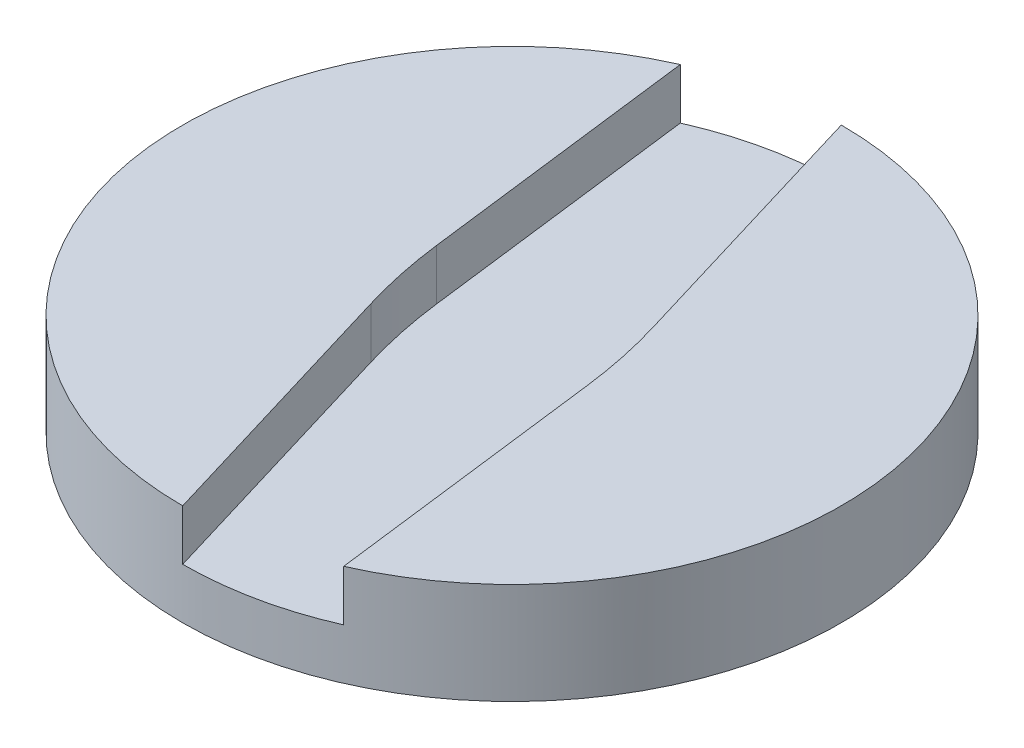
ISO-10303-21;
HEADER;
FILE_DESCRIPTION(('STEP AP214'),'2;1');
FILE_NAME('part.step','',(''),(''),'','','');
FILE_SCHEMA(('AUTOMOTIVE_DESIGN { 1 0 10303 214 1 1 1 1 }'));
ENDSEC;
DATA;
#1=APPLICATION_CONTEXT('core data for automotive mechanical design processes');
#2=APPLICATION_PROTOCOL_DEFINITION('international standard','automotive_design',2000,#1);
#3=PRODUCT_CONTEXT('',#1,'mechanical');
#4=PRODUCT('Part','Part','',(#3));
#5=PRODUCT_RELATED_PRODUCT_CATEGORY('part','',(#4));
#6=PRODUCT_DEFINITION_FORMATION('','',#4);
#7=PRODUCT_DEFINITION_CONTEXT('part definition',#1,'design');
#8=PRODUCT_DEFINITION('design','',#6,#7);
#9=PRODUCT_DEFINITION_SHAPE('','',#8);
#10=(LENGTH_UNIT() NAMED_UNIT(*) SI_UNIT(.MILLI.,.METRE.));
#11=(NAMED_UNIT(*) PLANE_ANGLE_UNIT() SI_UNIT($,.RADIAN.));
#12=(NAMED_UNIT(*) SI_UNIT($,.STERADIAN.) SOLID_ANGLE_UNIT());
#13=UNCERTAINTY_MEASURE_WITH_UNIT(LENGTH_MEASURE(1.E-05),#10,'distance_accuracy_value','');
#14=(GEOMETRIC_REPRESENTATION_CONTEXT(3) GLOBAL_UNCERTAINTY_ASSIGNED_CONTEXT((#13)) GLOBAL_UNIT_ASSIGNED_CONTEXT((#10,
#11,#12)) REPRESENTATION_CONTEXT('',''));
#15=CARTESIAN_POINT('',(0.,0.,0.));
#16=DIRECTION('',(0.,0.,1.));
#17=DIRECTION('',(1.,0.,0.));
#18=AXIS2_PLACEMENT_3D('',#15,#16,#17);
#19=CARTESIAN_POINT('',(0.,4.,0.));
#20=DIRECTION('',(0.,1.,0.));
#21=DIRECTION('',(0.,0.,1.));
#22=AXIS2_PLACEMENT_3D('',#19,#20,#21);
#23=PLANE('',#22);
#24=DIRECTION('',(-0.288132281827964,0.,-0.957590616165703));
#25=VECTOR('',#24,1.);
#26=CARTESIAN_POINT('',(3.18401077240658,4.,-2.38715001854733));
#27=LINE('',#26,#25);
#28=CARTESIAN_POINT('',(3.18401077240658,4.,-2.38715001854733));
#29=VERTEX_POINT('',#28);
#30=CARTESIAN_POINT('',(-0.00932114859532882,4.,-13.));
#31=VERTEX_POINT('',#30);
#32=EDGE_CURVE('E134',#29,#31,#27,.T.);
#33=ORIENTED_EDGE('',*,*,#32,.F.);
#34=CARTESIAN_POINT('',(-15.9678015509075,4.,3.37549561801202));
#35=DIRECTION('',(0.,1.,0.));
#36=DIRECTION('',(0.,0.,1.));
#37=AXIS2_PLACEMENT_3D('',#34,#35,#36);
#38=CIRCLE('',#37,20.);
#39=CARTESIAN_POINT('',(3.87769932245438,4.,0.8943476809888));
#40=VERTEX_POINT('',#39);
#41=EDGE_CURVE('E150',#40,#29,#38,.T.);
#42=ORIENTED_EDGE('',*,*,#41,.F.);
#43=DIRECTION('',(-0.124057396851164,0.,-0.992275043668092));
#44=VECTOR('',#43,1.);
#45=CARTESIAN_POINT('',(3.70792725026108,4.,-0.463576913796444));
#46=LINE('',#45,#44);
#47=CARTESIAN_POINT('',(5.25261058951684,4.,11.8915971170779));
#48=VERTEX_POINT('',#47);
#49=EDGE_CURVE('E190',#48,#40,#46,.T.);
#50=ORIENTED_EDGE('',*,*,#49,.F.);
#51=CARTESIAN_POINT('',(0.,4.,0.));
#52=DIRECTION('',(0.,1.,0.));
#53=DIRECTION('',(0.,0.,1.));
#54=AXIS2_PLACEMENT_3D('',#51,#52,#53);
#55=CIRCLE('',#54,13.);
#56=EDGE_CURVE('E184',#48,#31,#55,.T.);
#57=ORIENTED_EDGE('',*,*,#56,.T.);
#58=EDGE_LOOP('',(#33,#42,#50,#57));
#59=FACE_BOUND('',#58,.T.);
#60=ADVANCED_FACE('F45',(#59),#23,.T.);
#61=CARTESIAN_POINT('',(0.,4.,0.));
#62=DIRECTION('',(0.,-1.,0.));
#63=DIRECTION('',(0.,0.,-1.));
#64=AXIS2_PLACEMENT_3D('',#61,#62,#63);
#65=CYLINDRICAL_SURFACE('',#64,13.);
#66=ORIENTED_EDGE('',*,*,#56,.F.);
#67=DIRECTION('',(0.,-1.,0.));
#68=VECTOR('',#67,1.);
#69=CARTESIAN_POINT('',(5.25261058951683,4.,11.8915971170779));
#70=LINE('',#69,#68);
#71=CARTESIAN_POINT('',(5.25261058951683,2.,11.8915971170779));
#72=VERTEX_POINT('',#71);
#73=EDGE_CURVE('E167',#48,#72,#70,.T.);
#74=ORIENTED_EDGE('',*,*,#73,.T.);
#75=CARTESIAN_POINT('',(0.,2.,0.));
#76=DIRECTION('',(0.,1.,0.));
#77=DIRECTION('',(0.,0.,1.));
#78=AXIS2_PLACEMENT_3D('',#75,#76,#77);
#79=CIRCLE('',#78,13.);
#80=CARTESIAN_POINT('',(0.00932014332247211,2.,12.9999966590353));
#81=VERTEX_POINT('',#80);
#82=EDGE_CURVE('E11',#81,#72,#79,.T.);
#83=ORIENTED_EDGE('',*,*,#82,.F.);
#84=DIRECTION('',(0.,-1.,0.));
#85=VECTOR('',#84,1.);
#86=CARTESIAN_POINT('',(0.00932014332247211,4.,12.9999966590353));
#87=LINE('',#86,#85);
#88=CARTESIAN_POINT('',(0.0093211485952603,4.,13.));
#89=VERTEX_POINT('',#88);
#90=EDGE_CURVE('E125',#81,#89,#87,.F.);
#91=ORIENTED_EDGE('',*,*,#90,.T.);
#92=CARTESIAN_POINT('',(-5.25261058951682,4.,-11.8915971170779));
#93=VERTEX_POINT('',#92);
#94=EDGE_CURVE('E180',#93,#89,#55,.T.);
#95=ORIENTED_EDGE('',*,*,#94,.F.);
#96=DIRECTION('',(0.,-1.,0.));
#97=VECTOR('',#96,1.);
#98=CARTESIAN_POINT('',(-5.25261058951682,4.,-11.8915971170779));
#99=LINE('',#98,#97);
#100=CARTESIAN_POINT('',(-5.25261058951682,2.,-11.8915971170779));
#101=VERTEX_POINT('',#100);
#102=EDGE_CURVE('E175',#93,#101,#99,.T.);
#103=ORIENTED_EDGE('',*,*,#102,.T.);
#104=CARTESIAN_POINT('',(-0.00932014332254106,2.,-12.9999966590353));
#105=VERTEX_POINT('',#104);
#106=EDGE_CURVE('E49',#105,#101,#79,.T.);
#107=ORIENTED_EDGE('',*,*,#106,.F.);
#108=DIRECTION('',(0.,-1.,0.));
#109=VECTOR('',#108,1.);
#110=CARTESIAN_POINT('',(-0.00932014332253976,4.,-12.9999966590353));
#111=LINE('',#110,#109);
#112=EDGE_CURVE('E171',#105,#31,#111,.F.);
#113=ORIENTED_EDGE('',*,*,#112,.T.);
#114=EDGE_LOOP('',(#66,#74,#83,#91,#95,#103,#107,#113));
#115=FACE_BOUND('',#114,.T.);
#116=CARTESIAN_POINT('',(0.,0.,0.));
#117=DIRECTION('',(0.,1.,0.));
#118=DIRECTION('',(0.,0.,1.));
#119=AXIS2_PLACEMENT_3D('',#116,#117,#118);
#120=CIRCLE('',#119,13.);
#121=CARTESIAN_POINT('',(0.,0.,13.));
#122=VERTEX_POINT('',#121);
#123=EDGE_CURVE('E179',#122,#122,#120,.T.);
#124=ORIENTED_EDGE('',*,*,#123,.T.);
#125=EDGE_LOOP('',(#124));
#126=FACE_BOUND('',#125,.T.);
#127=ADVANCED_FACE('F47',(#115,#126),#65,.T.);
#128=DIRECTION('',(0.124057396851164,0.,0.992275043668092));
#129=VECTOR('',#128,1.);
#130=CARTESIAN_POINT('',(-3.70792725026107,4.,0.463576913796442));
#131=LINE('',#130,#129);
#132=CARTESIAN_POINT('',(-3.87769932245431,4.,-0.894347680988357));
#133=VERTEX_POINT('',#132);
#134=EDGE_CURVE('E188',#93,#133,#131,.T.);
#135=ORIENTED_EDGE('',*,*,#134,.F.);
#136=ORIENTED_EDGE('',*,*,#94,.T.);
#137=DIRECTION('',(0.288132281827964,0.,0.957590616165703));
#138=VECTOR('',#137,1.);
#139=CARTESIAN_POINT('',(-3.18401077240651,4.,2.38715001854777));
#140=LINE('',#139,#138);
#141=CARTESIAN_POINT('',(-3.18401077240651,4.,2.38715001854777));
#142=VERTEX_POINT('',#141);
#143=EDGE_CURVE('E147',#142,#89,#140,.T.);
#144=ORIENTED_EDGE('',*,*,#143,.F.);
#145=CARTESIAN_POINT('',(15.9678015509075,4.,-3.37549561801157));
#146=DIRECTION('',(0.,1.,0.));
#147=DIRECTION('',(0.,0.,1.));
#148=AXIS2_PLACEMENT_3D('',#145,#146,#147);
#149=CIRCLE('',#148,20.);
#150=EDGE_CURVE('E115',#133,#142,#149,.T.);
#151=ORIENTED_EDGE('',*,*,#150,.F.);
#152=EDGE_LOOP('',(#135,#136,#144,#151));
#153=FACE_BOUND('',#152,.T.);
#154=ADVANCED_FACE('F217',(#153),#23,.T.);
#155=CARTESIAN_POINT('',(0.,0.,0.));
#156=DIRECTION('',(0.,1.,0.));
#157=DIRECTION('',(0.,0.,1.));
#158=AXIS2_PLACEMENT_3D('',#155,#156,#157);
#159=PLANE('',#158);
#160=ORIENTED_EDGE('',*,*,#123,.F.);
#161=EDGE_LOOP('',(#160));
#162=FACE_BOUND('',#161,.T.);
#163=ADVANCED_FACE('F219',(#162),#159,.F.);
#164=CARTESIAN_POINT('',(15.9678015509075,2.,-3.37549561801157));
#165=DIRECTION('',(0.,1.,0.));
#166=DIRECTION('',(0.,0.,1.));
#167=AXIS2_PLACEMENT_3D('',#164,#165,#166);
#168=PLANE('',#167);
#169=ORIENTED_EDGE('',*,*,#82,.T.);
#170=DIRECTION('',(-0.124057396851164,0.,-0.992275043668091));
#171=VECTOR('',#170,1.);
#172=CARTESIAN_POINT('',(5.53132977786045,2.,14.1209369372307));
#173=LINE('',#172,#171);
#174=CARTESIAN_POINT('',(3.87769932245438,2.,0.8943476809888));
#175=VERTEX_POINT('',#174);
#176=EDGE_CURVE('E128',#72,#175,#173,.T.);
#177=ORIENTED_EDGE('',*,*,#176,.T.);
#178=CARTESIAN_POINT('',(-15.9678015509075,2.,3.37549561801202));
#179=DIRECTION('',(0.,1.,0.));
#180=DIRECTION('',(0.,0.,1.));
#181=AXIS2_PLACEMENT_3D('',#178,#179,#180);
#182=CIRCLE('',#181,20.);
#183=CARTESIAN_POINT('',(3.18401077240658,2.,-2.38715001854733));
#184=VERTEX_POINT('',#183);
#185=EDGE_CURVE('E139',#175,#184,#182,.T.);
#186=ORIENTED_EDGE('',*,*,#185,.T.);
#187=DIRECTION('',(-0.288132281827964,0.,-0.957590616165703));
#188=VECTOR('',#187,1.);
#189=CARTESIAN_POINT('',(3.18401077240658,2.,-2.38715001854733));
#190=LINE('',#189,#188);
#191=EDGE_CURVE('E142',#184,#105,#190,.T.);
#192=ORIENTED_EDGE('',*,*,#191,.T.);
#193=ORIENTED_EDGE('',*,*,#106,.T.);
#194=DIRECTION('',(0.124057396851164,0.,0.992275043668091));
#195=VECTOR('',#194,1.);
#196=CARTESIAN_POINT('',(-5.53132977786038,2.,-14.1209369372302));
#197=LINE('',#196,#195);
#198=CARTESIAN_POINT('',(-3.87769932245431,2.,-0.894347680988357));
#199=VERTEX_POINT('',#198);
#200=EDGE_CURVE('E119',#101,#199,#197,.T.);
#201=ORIENTED_EDGE('',*,*,#200,.T.);
#202=CARTESIAN_POINT('',(15.9678015509075,2.,-3.37549561801157));
#203=DIRECTION('',(0.,1.,0.));
#204=DIRECTION('',(0.,0.,1.));
#205=AXIS2_PLACEMENT_3D('',#202,#203,#204);
#206=CIRCLE('',#205,20.);
#207=CARTESIAN_POINT('',(-3.18401077240651,2.,2.38715001854777));
#208=VERTEX_POINT('',#207);
#209=EDGE_CURVE('E112',#199,#208,#206,.T.);
#210=ORIENTED_EDGE('',*,*,#209,.T.);
#211=DIRECTION('',(0.288132281827964,0.,0.957590616165703));
#212=VECTOR('',#211,1.);
#213=CARTESIAN_POINT('',(-3.18401077240651,2.,2.38715001854777));
#214=LINE('',#213,#212);
#215=EDGE_CURVE('E122',#208,#81,#214,.T.);
#216=ORIENTED_EDGE('',*,*,#215,.T.);
#217=EDGE_LOOP('',(#169,#177,#186,#192,#193,#201,#210,#216));
#218=FACE_BOUND('',#217,.T.);
#219=ADVANCED_FACE('F130',(#218),#168,.T.);
#220=CARTESIAN_POINT('',(-5.53132977786038,2.,-14.1209369372302));
#221=DIRECTION('',(-0.992275043668091,0.,0.124057396851164));
#222=DIRECTION('',(0.124057396851164,0.,0.992275043668092));
#223=AXIS2_PLACEMENT_3D('',#220,#221,#222);
#224=PLANE('',#223);
#225=ORIENTED_EDGE('',*,*,#134,.T.);
#226=DIRECTION('',(0.,1.,0.));
#227=VECTOR('',#226,1.);
#228=CARTESIAN_POINT('',(-3.87769932245431,2.,-0.894347680988357));
#229=LINE('',#228,#227);
#230=EDGE_CURVE('E156',#199,#133,#229,.T.);
#231=ORIENTED_EDGE('',*,*,#230,.F.);
#232=ORIENTED_EDGE('',*,*,#200,.F.);
#233=ORIENTED_EDGE('',*,*,#102,.F.);
#234=EDGE_LOOP('',(#225,#231,#232,#233));
#235=FACE_BOUND('',#234,.T.);
#236=ADVANCED_FACE('F215',(#235),#224,.F.);
#237=CARTESIAN_POINT('',(3.18401077240658,2.,-2.38715001854733));
#238=DIRECTION('',(0.957590616165703,0.,-0.288132281827964));
#239=DIRECTION('',(-0.288132281827964,0.,-0.957590616165703));
#240=AXIS2_PLACEMENT_3D('',#237,#238,#239);
#241=PLANE('',#240);
#242=ORIENTED_EDGE('',*,*,#191,.F.);
#243=DIRECTION('',(0.,1.,0.));
#244=VECTOR('',#243,1.);
#245=CARTESIAN_POINT('',(3.18401077240658,2.,-2.38715001854733));
#246=LINE('',#245,#244);
#247=EDGE_CURVE('E159',#184,#29,#246,.T.);
#248=ORIENTED_EDGE('',*,*,#247,.T.);
#249=ORIENTED_EDGE('',*,*,#32,.T.);
#250=ORIENTED_EDGE('',*,*,#112,.F.);
#251=EDGE_LOOP('',(#242,#248,#249,#250));
#252=FACE_BOUND('',#251,.T.);
#253=ADVANCED_FACE('F209',(#252),#241,.F.);
#254=CARTESIAN_POINT('',(5.53132977786045,2.,14.1209369372307));
#255=DIRECTION('',(0.992275043668091,0.,-0.124057396851164));
#256=DIRECTION('',(-0.124057396851164,0.,-0.992275043668092));
#257=AXIS2_PLACEMENT_3D('',#254,#255,#256);
#258=PLANE('',#257);
#259=ORIENTED_EDGE('',*,*,#49,.T.);
#260=DIRECTION('',(0.,1.,0.));
#261=VECTOR('',#260,1.);
#262=CARTESIAN_POINT('',(3.87769932245438,2.,0.8943476809888));
#263=LINE('',#262,#261);
#264=EDGE_CURVE('E118',#175,#40,#263,.T.);
#265=ORIENTED_EDGE('',*,*,#264,.F.);
#266=ORIENTED_EDGE('',*,*,#176,.F.);
#267=ORIENTED_EDGE('',*,*,#73,.F.);
#268=EDGE_LOOP('',(#259,#265,#266,#267));
#269=FACE_BOUND('',#268,.T.);
#270=ADVANCED_FACE('F196',(#269),#258,.F.);
#271=CARTESIAN_POINT('',(-3.18401077240651,2.,2.38715001854777));
#272=DIRECTION('',(-0.957590616165703,0.,0.288132281827964));
#273=DIRECTION('',(0.288132281827964,0.,0.957590616165703));
#274=AXIS2_PLACEMENT_3D('',#271,#272,#273);
#275=PLANE('',#274);
#276=ORIENTED_EDGE('',*,*,#215,.F.);
#277=DIRECTION('',(0.,1.,0.));
#278=VECTOR('',#277,1.);
#279=CARTESIAN_POINT('',(-3.18401077240651,2.,2.38715001854777));
#280=LINE('',#279,#278);
#281=EDGE_CURVE('E61',#208,#142,#280,.T.);
#282=ORIENTED_EDGE('',*,*,#281,.T.);
#283=ORIENTED_EDGE('',*,*,#143,.T.);
#284=ORIENTED_EDGE('',*,*,#90,.F.);
#285=EDGE_LOOP('',(#276,#282,#283,#284));
#286=FACE_BOUND('',#285,.T.);
#287=ADVANCED_FACE('F123',(#286),#275,.F.);
#288=CARTESIAN_POINT('',(15.9678015509075,2.,-3.37549561801157));
#289=DIRECTION('',(0.,1.,0.));
#290=DIRECTION('',(0.,0.,1.));
#291=AXIS2_PLACEMENT_3D('',#288,#289,#290);
#292=CYLINDRICAL_SURFACE('',#291,20.);
#293=ORIENTED_EDGE('',*,*,#150,.T.);
#294=ORIENTED_EDGE('',*,*,#281,.F.);
#295=ORIENTED_EDGE('',*,*,#209,.F.);
#296=ORIENTED_EDGE('',*,*,#230,.T.);
#297=EDGE_LOOP('',(#293,#294,#295,#296));
#298=FACE_BOUND('',#297,.T.);
#299=ADVANCED_FACE('F109',(#298),#292,.F.);
#300=CARTESIAN_POINT('',(-15.9678015509075,2.,3.37549561801202));
#301=DIRECTION('',(0.,1.,0.));
#302=DIRECTION('',(0.,0.,1.));
#303=AXIS2_PLACEMENT_3D('',#300,#301,#302);
#304=CYLINDRICAL_SURFACE('',#303,20.);
#305=ORIENTED_EDGE('',*,*,#41,.T.);
#306=ORIENTED_EDGE('',*,*,#247,.F.);
#307=ORIENTED_EDGE('',*,*,#185,.F.);
#308=ORIENTED_EDGE('',*,*,#264,.T.);
#309=EDGE_LOOP('',(#305,#306,#307,#308));
#310=FACE_BOUND('',#309,.T.);
#311=ADVANCED_FACE('F204',(#310),#304,.F.);
#312=CLOSED_SHELL('',(#60,#127,#154,#163,#219,#236,#253,#270,#287,#299,#311));
#313=MANIFOLD_SOLID_BREP('B2',#312);
#314=ADVANCED_BREP_SHAPE_REPRESENTATION('',(#18,#313),#14);
#315=SHAPE_DEFINITION_REPRESENTATION(#9,#314);
ENDSEC;
END-ISO-10303-21;
